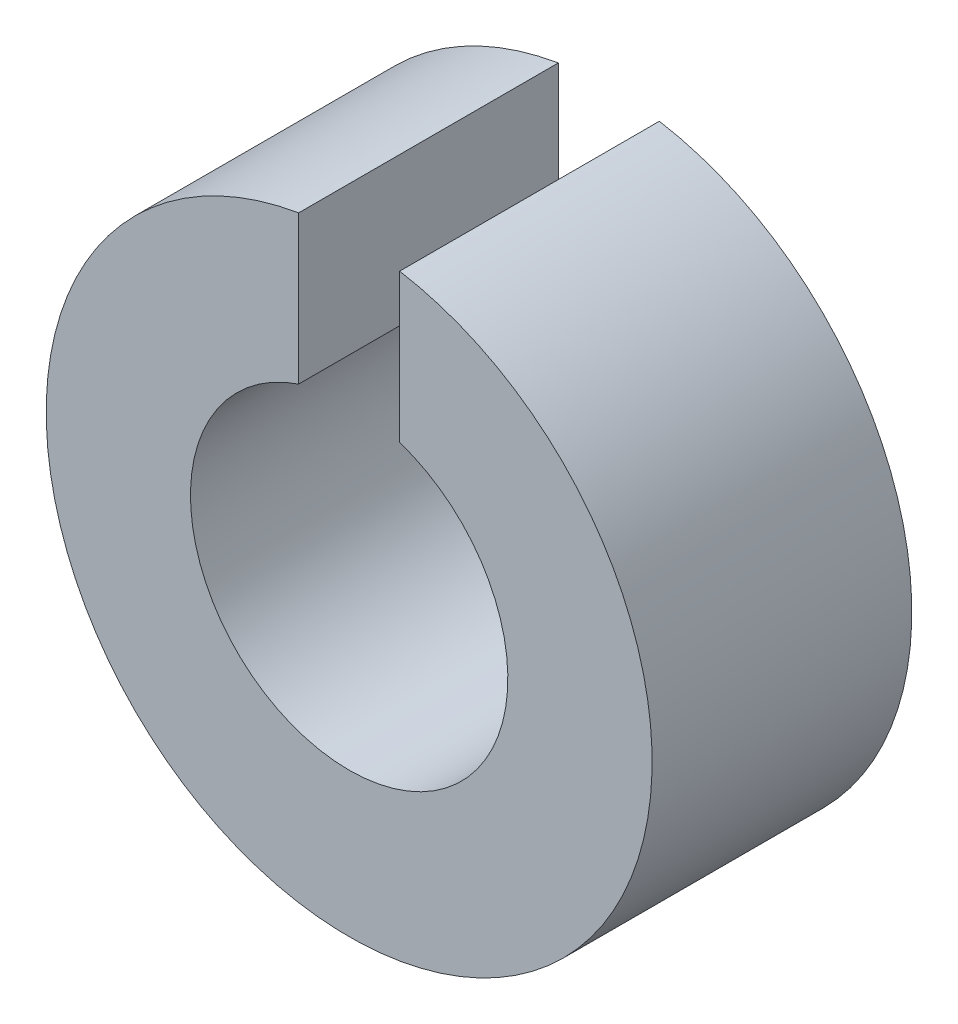
ISO-10303-21;
HEADER;
FILE_DESCRIPTION(('STEP AP214'),'2;1');
FILE_NAME('part.step','',(''),(''),'','','');
FILE_SCHEMA(('AUTOMOTIVE_DESIGN { 1 0 10303 214 1 1 1 1 }'));
ENDSEC;
DATA;
#1=APPLICATION_CONTEXT('core data for automotive mechanical design processes');
#2=APPLICATION_PROTOCOL_DEFINITION('international standard','automotive_design',2000,#1);
#3=PRODUCT_CONTEXT('',#1,'mechanical');
#4=PRODUCT('Part','Part','',(#3));
#5=PRODUCT_RELATED_PRODUCT_CATEGORY('part','',(#4));
#6=PRODUCT_DEFINITION_FORMATION('','',#4);
#7=PRODUCT_DEFINITION_CONTEXT('part definition',#1,'design');
#8=PRODUCT_DEFINITION('design','',#6,#7);
#9=PRODUCT_DEFINITION_SHAPE('','',#8);
#10=(LENGTH_UNIT() NAMED_UNIT(*) SI_UNIT(.MILLI.,.METRE.));
#11=(NAMED_UNIT(*) PLANE_ANGLE_UNIT() SI_UNIT($,.RADIAN.));
#12=(NAMED_UNIT(*) SI_UNIT($,.STERADIAN.) SOLID_ANGLE_UNIT());
#13=UNCERTAINTY_MEASURE_WITH_UNIT(LENGTH_MEASURE(1.E-05),#10,'distance_accuracy_value','');
#14=(GEOMETRIC_REPRESENTATION_CONTEXT(3) GLOBAL_UNCERTAINTY_ASSIGNED_CONTEXT((#13)) GLOBAL_UNIT_ASSIGNED_CONTEXT((#10,
#11,#12)) REPRESENTATION_CONTEXT('',''));
#15=CARTESIAN_POINT('',(0.,0.,0.));
#16=DIRECTION('',(0.,0.,1.));
#17=DIRECTION('',(1.,0.,0.));
#18=AXIS2_PLACEMENT_3D('',#15,#16,#17);
#19=CARTESIAN_POINT('',(0.,0.,9.));
#20=DIRECTION('',(0.,0.,1.));
#21=DIRECTION('',(1.,0.,0.));
#22=AXIS2_PLACEMENT_3D('',#19,#20,#21);
#23=PLANE('',#22);
#24=DIRECTION('',(0.,1.,0.));
#25=VECTOR('',#24,1.);
#26=CARTESIAN_POINT('',(1.75,18.,9.));
#27=LINE('',#26,#25);
#28=CARTESIAN_POINT('',(1.75,5.21416340365355,9.));
#29=VERTEX_POINT('',#28);
#30=CARTESIAN_POINT('',(1.75,10.3531396204243,9.));
#31=VERTEX_POINT('',#30);
#32=EDGE_CURVE('E75',#29,#31,#27,.T.);
#33=ORIENTED_EDGE('',*,*,#32,.F.);
#34=CARTESIAN_POINT('',(0.,0.,9.));
#35=DIRECTION('',(0.,0.,1.));
#36=DIRECTION('',(1.,0.,0.));
#37=AXIS2_PLACEMENT_3D('',#34,#35,#36);
#38=CIRCLE('',#37,5.5);
#39=CARTESIAN_POINT('',(-1.75,5.21416340365355,9.));
#40=VERTEX_POINT('',#39);
#41=EDGE_CURVE('E84',#40,#29,#38,.T.);
#42=ORIENTED_EDGE('',*,*,#41,.F.);
#43=DIRECTION('',(0.,-1.,0.));
#44=VECTOR('',#43,1.);
#45=CARTESIAN_POINT('',(-1.75,18.,9.));
#46=LINE('',#45,#44);
#47=CARTESIAN_POINT('',(-1.75,10.3531396204243,9.));
#48=VERTEX_POINT('',#47);
#49=EDGE_CURVE('E58',#48,#40,#46,.T.);
#50=ORIENTED_EDGE('',*,*,#49,.F.);
#51=CARTESIAN_POINT('',(0.,0.,9.));
#52=DIRECTION('',(0.,0.,1.));
#53=DIRECTION('',(1.,0.,0.));
#54=AXIS2_PLACEMENT_3D('',#51,#52,#53);
#55=CIRCLE('',#54,10.5);
#56=EDGE_CURVE('E86',#48,#31,#55,.T.);
#57=ORIENTED_EDGE('',*,*,#56,.T.);
#58=EDGE_LOOP('',(#33,#42,#50,#57));
#59=FACE_BOUND('',#58,.T.);
#60=ADVANCED_FACE('F36',(#59),#23,.T.);
#61=CARTESIAN_POINT('',(0.,0.,0.));
#62=DIRECTION('',(0.,0.,1.));
#63=DIRECTION('',(1.,0.,0.));
#64=AXIS2_PLACEMENT_3D('',#61,#62,#63);
#65=PLANE('',#64);
#66=CARTESIAN_POINT('',(0.,0.,0.));
#67=DIRECTION('',(0.,0.,1.));
#68=DIRECTION('',(1.,0.,0.));
#69=AXIS2_PLACEMENT_3D('',#66,#67,#68);
#70=CIRCLE('',#69,5.5);
#71=CARTESIAN_POINT('',(-1.75,5.21416340365355,0.));
#72=VERTEX_POINT('',#71);
#73=CARTESIAN_POINT('',(1.75,5.21416340365355,0.));
#74=VERTEX_POINT('',#73);
#75=EDGE_CURVE('E90',#72,#74,#70,.T.);
#76=ORIENTED_EDGE('',*,*,#75,.T.);
#77=DIRECTION('',(0.,1.,0.));
#78=VECTOR('',#77,1.);
#79=CARTESIAN_POINT('',(1.75,18.,0.));
#80=LINE('',#79,#78);
#81=CARTESIAN_POINT('',(1.75,10.3531396204243,0.));
#82=VERTEX_POINT('',#81);
#83=EDGE_CURVE('E50',#74,#82,#80,.T.);
#84=ORIENTED_EDGE('',*,*,#83,.T.);
#85=CARTESIAN_POINT('',(0.,0.,0.));
#86=DIRECTION('',(0.,0.,1.));
#87=DIRECTION('',(1.,0.,0.));
#88=AXIS2_PLACEMENT_3D('',#85,#86,#87);
#89=CIRCLE('',#88,10.5);
#90=CARTESIAN_POINT('',(-1.75,10.3531396204243,0.));
#91=VERTEX_POINT('',#90);
#92=EDGE_CURVE('E89',#91,#82,#89,.T.);
#93=ORIENTED_EDGE('',*,*,#92,.F.);
#94=DIRECTION('',(0.,-1.,0.));
#95=VECTOR('',#94,1.);
#96=CARTESIAN_POINT('',(-1.75,18.,0.));
#97=LINE('',#96,#95);
#98=EDGE_CURVE('E101',#91,#72,#97,.T.);
#99=ORIENTED_EDGE('',*,*,#98,.T.);
#100=EDGE_LOOP('',(#76,#84,#93,#99));
#101=FACE_BOUND('',#100,.T.);
#102=ADVANCED_FACE('F105',(#101),#65,.F.);
#103=CARTESIAN_POINT('',(0.,0.,9.));
#104=DIRECTION('',(0.,0.,-1.));
#105=DIRECTION('',(-1.,0.,0.));
#106=AXIS2_PLACEMENT_3D('',#103,#104,#105);
#107=CYLINDRICAL_SURFACE('',#106,10.5);
#108=ORIENTED_EDGE('',*,*,#92,.T.);
#109=DIRECTION('',(0.,0.,-1.));
#110=VECTOR('',#109,1.);
#111=CARTESIAN_POINT('',(1.75,10.3531396204243,9.));
#112=LINE('',#111,#110);
#113=EDGE_CURVE('E94',#82,#31,#112,.F.);
#114=ORIENTED_EDGE('',*,*,#113,.T.);
#115=ORIENTED_EDGE('',*,*,#56,.F.);
#116=DIRECTION('',(0.,0.,-1.));
#117=VECTOR('',#116,1.);
#118=CARTESIAN_POINT('',(-1.75,10.3531396204243,9.));
#119=LINE('',#118,#117);
#120=EDGE_CURVE('E106',#48,#91,#119,.T.);
#121=ORIENTED_EDGE('',*,*,#120,.T.);
#122=EDGE_LOOP('',(#108,#114,#115,#121));
#123=FACE_BOUND('',#122,.T.);
#124=ADVANCED_FACE('F38',(#123),#107,.T.);
#125=CARTESIAN_POINT('',(0.,0.,9.));
#126=DIRECTION('',(0.,0.,-1.));
#127=DIRECTION('',(-1.,0.,0.));
#128=AXIS2_PLACEMENT_3D('',#125,#126,#127);
#129=CYLINDRICAL_SURFACE('',#128,5.5);
#130=DIRECTION('',(0.,0.,-1.));
#131=VECTOR('',#130,1.);
#132=CARTESIAN_POINT('',(1.75,5.21416340365355,9.));
#133=LINE('',#132,#131);
#134=EDGE_CURVE('E11',#74,#29,#133,.F.);
#135=ORIENTED_EDGE('',*,*,#134,.F.);
#136=ORIENTED_EDGE('',*,*,#75,.F.);
#137=DIRECTION('',(0.,0.,-1.));
#138=VECTOR('',#137,1.);
#139=CARTESIAN_POINT('',(-1.75,5.21416340365355,9.));
#140=LINE('',#139,#138);
#141=EDGE_CURVE('E44',#40,#72,#140,.T.);
#142=ORIENTED_EDGE('',*,*,#141,.F.);
#143=ORIENTED_EDGE('',*,*,#41,.T.);
#144=EDGE_LOOP('',(#135,#136,#142,#143));
#145=FACE_BOUND('',#144,.T.);
#146=ADVANCED_FACE('F88',(#145),#129,.F.);
#147=CARTESIAN_POINT('',(-1.75,18.,0.));
#148=DIRECTION('',(-1.,0.,0.));
#149=DIRECTION('',(0.,-1.,0.));
#150=AXIS2_PLACEMENT_3D('',#147,#148,#149);
#151=PLANE('',#150);
#152=ORIENTED_EDGE('',*,*,#49,.T.);
#153=ORIENTED_EDGE('',*,*,#141,.T.);
#154=ORIENTED_EDGE('',*,*,#98,.F.);
#155=ORIENTED_EDGE('',*,*,#120,.F.);
#156=EDGE_LOOP('',(#152,#153,#154,#155));
#157=FACE_BOUND('',#156,.T.);
#158=ADVANCED_FACE('F100',(#157),#151,.F.);
#159=CARTESIAN_POINT('',(1.75,18.,0.));
#160=DIRECTION('',(1.,0.,0.));
#161=DIRECTION('',(0.,1.,0.));
#162=AXIS2_PLACEMENT_3D('',#159,#160,#161);
#163=PLANE('',#162);
#164=ORIENTED_EDGE('',*,*,#83,.F.);
#165=ORIENTED_EDGE('',*,*,#134,.T.);
#166=ORIENTED_EDGE('',*,*,#32,.T.);
#167=ORIENTED_EDGE('',*,*,#113,.F.);
#168=EDGE_LOOP('',(#164,#165,#166,#167));
#169=FACE_BOUND('',#168,.T.);
#170=ADVANCED_FACE('F74',(#169),#163,.F.);
#171=CLOSED_SHELL('',(#60,#102,#124,#146,#158,#170));
#172=MANIFOLD_SOLID_BREP('B2',#171);
#173=ADVANCED_BREP_SHAPE_REPRESENTATION('',(#18,#172),#14);
#174=SHAPE_DEFINITION_REPRESENTATION(#9,#173);
ENDSEC;
END-ISO-10303-21;
